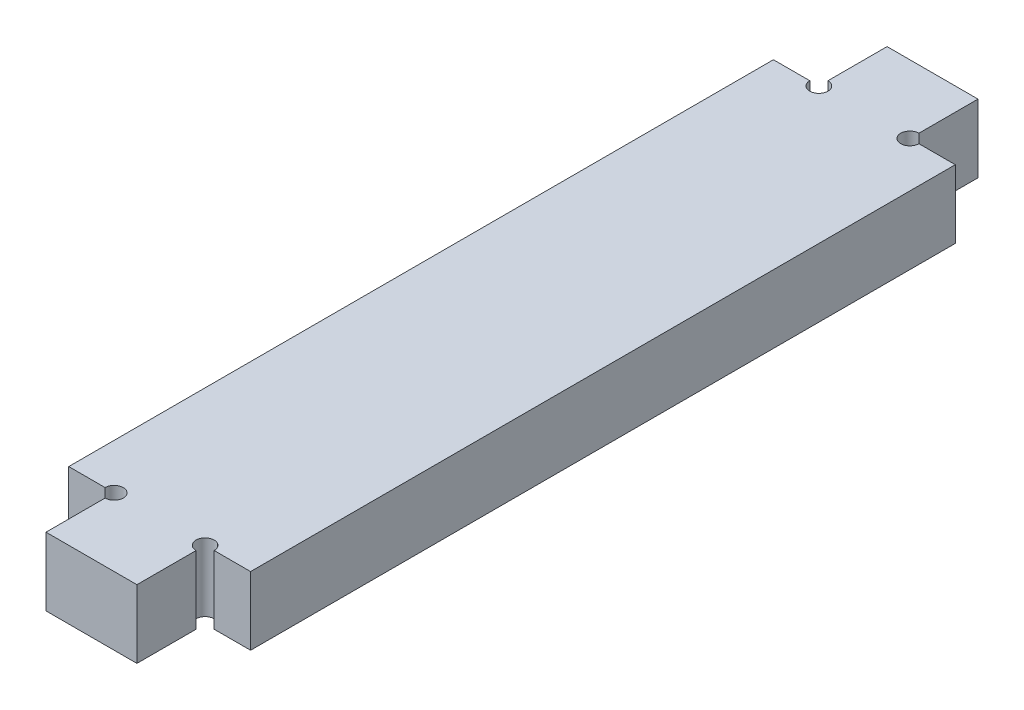
ISO-10303-21;
HEADER;
FILE_DESCRIPTION(('STEP AP214'),'2;1');
FILE_NAME('part.step','',(''),(''),'','','');
FILE_SCHEMA(('AUTOMOTIVE_DESIGN { 1 0 10303 214 1 1 1 1 }'));
ENDSEC;
DATA;
#1=APPLICATION_CONTEXT('core data for automotive mechanical design processes');
#2=APPLICATION_PROTOCOL_DEFINITION('international standard','automotive_design',2000,#1);
#3=PRODUCT_CONTEXT('',#1,'mechanical');
#4=PRODUCT('Part','Part','',(#3));
#5=PRODUCT_RELATED_PRODUCT_CATEGORY('part','',(#4));
#6=PRODUCT_DEFINITION_FORMATION('','',#4);
#7=PRODUCT_DEFINITION_CONTEXT('part definition',#1,'design');
#8=PRODUCT_DEFINITION('design','',#6,#7);
#9=PRODUCT_DEFINITION_SHAPE('','',#8);
#10=(LENGTH_UNIT() NAMED_UNIT(*) SI_UNIT(.MILLI.,.METRE.));
#11=(NAMED_UNIT(*) PLANE_ANGLE_UNIT() SI_UNIT($,.RADIAN.));
#12=(NAMED_UNIT(*) SI_UNIT($,.STERADIAN.) SOLID_ANGLE_UNIT());
#13=UNCERTAINTY_MEASURE_WITH_UNIT(LENGTH_MEASURE(1.E-05),#10,'distance_accuracy_value','');
#14=(GEOMETRIC_REPRESENTATION_CONTEXT(3) GLOBAL_UNCERTAINTY_ASSIGNED_CONTEXT((#13)) GLOBAL_UNIT_ASSIGNED_CONTEXT((#10,
#11,#12)) REPRESENTATION_CONTEXT('',''));
#15=CARTESIAN_POINT('',(0.,0.,0.));
#16=DIRECTION('',(0.,0.,1.));
#17=DIRECTION('',(1.,0.,0.));
#18=AXIS2_PLACEMENT_3D('',#15,#16,#17);
#19=CARTESIAN_POINT('',(-4.,3.,-15.5));
#20=DIRECTION('',(1.,0.,0.));
#21=DIRECTION('',(0.,0.,-1.));
#22=AXIS2_PLACEMENT_3D('',#19,#20,#21);
#23=PLANE('',#22);
#24=DIRECTION('',(0.,0.,1.));
#25=VECTOR('',#24,1.);
#26=CARTESIAN_POINT('',(-4.,0.,-15.5));
#27=LINE('',#26,#25);
#28=CARTESIAN_POINT('',(-4.,0.,-15.5));
#29=VERTEX_POINT('',#28);
#30=CARTESIAN_POINT('',(-4.,0.,15.5));
#31=VERTEX_POINT('',#30);
#32=EDGE_CURVE('E219',#29,#31,#27,.T.);
#33=ORIENTED_EDGE('',*,*,#32,.T.);
#34=DIRECTION('',(0.,-1.,0.));
#35=VECTOR('',#34,1.);
#36=CARTESIAN_POINT('',(-4.,3.,15.5));
#37=LINE('',#36,#35);
#38=CARTESIAN_POINT('',(-4.,3.,15.5));
#39=VERTEX_POINT('',#38);
#40=EDGE_CURVE('E11',#39,#31,#37,.T.);
#41=ORIENTED_EDGE('',*,*,#40,.F.);
#42=DIRECTION('',(0.,0.,1.));
#43=VECTOR('',#42,1.);
#44=CARTESIAN_POINT('',(-4.,3.,-15.5));
#45=LINE('',#44,#43);
#46=CARTESIAN_POINT('',(-4.,3.,-15.5));
#47=VERTEX_POINT('',#46);
#48=EDGE_CURVE('E184',#47,#39,#45,.T.);
#49=ORIENTED_EDGE('',*,*,#48,.F.);
#50=DIRECTION('',(0.,-1.,0.));
#51=VECTOR('',#50,1.);
#52=CARTESIAN_POINT('',(-4.,3.,-15.5));
#53=LINE('',#52,#51);
#54=EDGE_CURVE('E185',#47,#29,#53,.T.);
#55=ORIENTED_EDGE('',*,*,#54,.T.);
#56=EDGE_LOOP('',(#33,#41,#49,#55));
#57=FACE_BOUND('',#56,.T.);
#58=ADVANCED_FACE('F33',(#57),#23,.F.);
#59=CARTESIAN_POINT('',(-4.,3.,15.5));
#60=DIRECTION('',(0.,0.,-1.));
#61=DIRECTION('',(-1.,0.,0.));
#62=AXIS2_PLACEMENT_3D('',#59,#60,#61);
#63=PLANE('',#62);
#64=DIRECTION('',(1.,0.,0.));
#65=VECTOR('',#64,1.);
#66=CARTESIAN_POINT('',(-4.,0.,15.5));
#67=LINE('',#66,#65);
#68=CARTESIAN_POINT('',(-2.4,0.,15.5));
#69=VERTEX_POINT('',#68);
#70=EDGE_CURVE('E214',#31,#69,#67,.T.);
#71=ORIENTED_EDGE('',*,*,#70,.T.);
#72=DIRECTION('',(0.,1.,0.));
#73=VECTOR('',#72,1.);
#74=CARTESIAN_POINT('',(-2.4,0.,15.5));
#75=LINE('',#74,#73);
#76=CARTESIAN_POINT('',(-2.4,3.,15.5));
#77=VERTEX_POINT('',#76);
#78=EDGE_CURVE('E55',#69,#77,#75,.T.);
#79=ORIENTED_EDGE('',*,*,#78,.T.);
#80=DIRECTION('',(1.,0.,0.));
#81=VECTOR('',#80,1.);
#82=CARTESIAN_POINT('',(-4.,3.,15.5));
#83=LINE('',#82,#81);
#84=EDGE_CURVE('E243',#39,#77,#83,.T.);
#85=ORIENTED_EDGE('',*,*,#84,.F.);
#86=ORIENTED_EDGE('',*,*,#40,.T.);
#87=EDGE_LOOP('',(#71,#79,#85,#86));
#88=FACE_BOUND('',#87,.T.);
#89=ADVANCED_FACE('F286',(#88),#63,.F.);
#90=CARTESIAN_POINT('',(-2.,3.,15.5));
#91=DIRECTION('',(1.,0.,0.));
#92=DIRECTION('',(0.,0.,-1.));
#93=AXIS2_PLACEMENT_3D('',#90,#91,#92);
#94=PLANE('',#93);
#95=DIRECTION('',(0.,0.,1.));
#96=VECTOR('',#95,1.);
#97=CARTESIAN_POINT('',(-2.,3.,15.5));
#98=LINE('',#97,#96);
#99=CARTESIAN_POINT('',(-1.99999999999999,3.,15.9));
#100=VERTEX_POINT('',#99);
#101=CARTESIAN_POINT('',(-2.,3.,18.5));
#102=VERTEX_POINT('',#101);
#103=EDGE_CURVE('E241',#100,#102,#98,.T.);
#104=ORIENTED_EDGE('',*,*,#103,.F.);
#105=DIRECTION('',(0.,1.,0.));
#106=VECTOR('',#105,1.);
#107=CARTESIAN_POINT('',(-1.99999999999999,0.,15.9));
#108=LINE('',#107,#106);
#109=CARTESIAN_POINT('',(-1.99999999999999,0.,15.9));
#110=VERTEX_POINT('',#109);
#111=EDGE_CURVE('E267',#110,#100,#108,.T.);
#112=ORIENTED_EDGE('',*,*,#111,.F.);
#113=DIRECTION('',(0.,0.,1.));
#114=VECTOR('',#113,1.);
#115=CARTESIAN_POINT('',(-2.,0.,15.5));
#116=LINE('',#115,#114);
#117=CARTESIAN_POINT('',(-2.,0.,18.5));
#118=VERTEX_POINT('',#117);
#119=EDGE_CURVE('E213',#110,#118,#116,.T.);
#120=ORIENTED_EDGE('',*,*,#119,.T.);
#121=DIRECTION('',(0.,-1.,0.));
#122=VECTOR('',#121,1.);
#123=CARTESIAN_POINT('',(-2.,3.,18.5));
#124=LINE('',#123,#122);
#125=EDGE_CURVE('E40',#102,#118,#124,.T.);
#126=ORIENTED_EDGE('',*,*,#125,.F.);
#127=EDGE_LOOP('',(#104,#112,#120,#126));
#128=FACE_BOUND('',#127,.T.);
#129=ADVANCED_FACE('F282',(#128),#94,.F.);
#130=CARTESIAN_POINT('',(2.00000000000001,3.,18.5));
#131=DIRECTION('',(0.,0.,-1.));
#132=DIRECTION('',(-1.,0.,0.));
#133=AXIS2_PLACEMENT_3D('',#130,#131,#132);
#134=PLANE('',#133);
#135=DIRECTION('',(1.,0.,0.));
#136=VECTOR('',#135,1.);
#137=CARTESIAN_POINT('',(2.00000000000001,0.,18.5));
#138=LINE('',#137,#136);
#139=CARTESIAN_POINT('',(2.00000000000001,0.,18.5));
#140=VERTEX_POINT('',#139);
#141=EDGE_CURVE('E169',#118,#140,#138,.T.);
#142=ORIENTED_EDGE('',*,*,#141,.T.);
#143=DIRECTION('',(0.,-1.,0.));
#144=VECTOR('',#143,1.);
#145=CARTESIAN_POINT('',(2.00000000000001,3.,18.5));
#146=LINE('',#145,#144);
#147=CARTESIAN_POINT('',(2.00000000000001,3.,18.5));
#148=VERTEX_POINT('',#147);
#149=EDGE_CURVE('E200',#148,#140,#146,.T.);
#150=ORIENTED_EDGE('',*,*,#149,.F.);
#151=DIRECTION('',(1.,0.,0.));
#152=VECTOR('',#151,1.);
#153=CARTESIAN_POINT('',(2.00000000000001,3.,18.5));
#154=LINE('',#153,#152);
#155=EDGE_CURVE('E209',#102,#148,#154,.T.);
#156=ORIENTED_EDGE('',*,*,#155,.F.);
#157=ORIENTED_EDGE('',*,*,#125,.T.);
#158=EDGE_LOOP('',(#142,#150,#156,#157));
#159=FACE_BOUND('',#158,.T.);
#160=ADVANCED_FACE('F207',(#159),#134,.F.);
#161=CARTESIAN_POINT('',(2.00000000000001,3.,15.5));
#162=DIRECTION('',(-1.,0.,0.));
#163=DIRECTION('',(0.,0.,1.));
#164=AXIS2_PLACEMENT_3D('',#161,#162,#163);
#165=PLANE('',#164);
#166=DIRECTION('',(0.,0.,-1.));
#167=VECTOR('',#166,1.);
#168=CARTESIAN_POINT('',(2.00000000000001,0.,15.5));
#169=LINE('',#168,#167);
#170=CARTESIAN_POINT('',(2.00000000000001,0.,15.9));
#171=VERTEX_POINT('',#170);
#172=EDGE_CURVE('E165',#140,#171,#169,.T.);
#173=ORIENTED_EDGE('',*,*,#172,.T.);
#174=DIRECTION('',(0.,1.,0.));
#175=VECTOR('',#174,1.);
#176=CARTESIAN_POINT('',(2.,0.,15.9));
#177=LINE('',#176,#175);
#178=CARTESIAN_POINT('',(2.,3.,15.9));
#179=VERTEX_POINT('',#178);
#180=EDGE_CURVE('E47',#171,#179,#177,.T.);
#181=ORIENTED_EDGE('',*,*,#180,.T.);
#182=DIRECTION('',(0.,0.,-1.));
#183=VECTOR('',#182,1.);
#184=CARTESIAN_POINT('',(2.00000000000001,3.,15.5));
#185=LINE('',#184,#183);
#186=EDGE_CURVE('E237',#148,#179,#185,.T.);
#187=ORIENTED_EDGE('',*,*,#186,.F.);
#188=ORIENTED_EDGE('',*,*,#149,.T.);
#189=EDGE_LOOP('',(#173,#181,#187,#188));
#190=FACE_BOUND('',#189,.T.);
#191=ADVANCED_FACE('F278',(#190),#165,.F.);
#192=CARTESIAN_POINT('',(4.00000000000001,3.,15.5));
#193=DIRECTION('',(0.,0.,-1.));
#194=DIRECTION('',(-1.,0.,0.));
#195=AXIS2_PLACEMENT_3D('',#192,#193,#194);
#196=PLANE('',#195);
#197=DIRECTION('',(1.,0.,0.));
#198=VECTOR('',#197,1.);
#199=CARTESIAN_POINT('',(4.00000000000001,3.,15.5));
#200=LINE('',#199,#198);
#201=CARTESIAN_POINT('',(2.4,3.,15.5));
#202=VERTEX_POINT('',#201);
#203=CARTESIAN_POINT('',(4.00000000000001,3.,15.5));
#204=VERTEX_POINT('',#203);
#205=EDGE_CURVE('E159',#202,#204,#200,.T.);
#206=ORIENTED_EDGE('',*,*,#205,.F.);
#207=DIRECTION('',(0.,1.,0.));
#208=VECTOR('',#207,1.);
#209=CARTESIAN_POINT('',(2.4,0.,15.5));
#210=LINE('',#209,#208);
#211=CARTESIAN_POINT('',(2.4,0.,15.5));
#212=VERTEX_POINT('',#211);
#213=EDGE_CURVE('E145',#212,#202,#210,.T.);
#214=ORIENTED_EDGE('',*,*,#213,.F.);
#215=DIRECTION('',(1.,0.,0.));
#216=VECTOR('',#215,1.);
#217=CARTESIAN_POINT('',(4.00000000000001,0.,15.5));
#218=LINE('',#217,#216);
#219=CARTESIAN_POINT('',(4.00000000000001,0.,15.5));
#220=VERTEX_POINT('',#219);
#221=EDGE_CURVE('E157',#212,#220,#218,.T.);
#222=ORIENTED_EDGE('',*,*,#221,.T.);
#223=DIRECTION('',(0.,-1.,0.));
#224=VECTOR('',#223,1.);
#225=CARTESIAN_POINT('',(4.00000000000001,3.,15.5));
#226=LINE('',#225,#224);
#227=EDGE_CURVE('E198',#204,#220,#226,.T.);
#228=ORIENTED_EDGE('',*,*,#227,.F.);
#229=EDGE_LOOP('',(#206,#214,#222,#228));
#230=FACE_BOUND('',#229,.T.);
#231=ADVANCED_FACE('F155',(#230),#196,.F.);
#232=CARTESIAN_POINT('',(4.,3.,-15.5));
#233=DIRECTION('',(-1.,0.,0.));
#234=DIRECTION('',(0.,0.,1.));
#235=AXIS2_PLACEMENT_3D('',#232,#233,#234);
#236=PLANE('',#235);
#237=DIRECTION('',(0.,0.,-1.));
#238=VECTOR('',#237,1.);
#239=CARTESIAN_POINT('',(4.,0.,-15.5));
#240=LINE('',#239,#238);
#241=CARTESIAN_POINT('',(4.,0.,-15.5));
#242=VERTEX_POINT('',#241);
#243=EDGE_CURVE('E164',#220,#242,#240,.T.);
#244=ORIENTED_EDGE('',*,*,#243,.T.);
#245=DIRECTION('',(0.,-1.,0.));
#246=VECTOR('',#245,1.);
#247=CARTESIAN_POINT('',(4.,3.,-15.5));
#248=LINE('',#247,#246);
#249=CARTESIAN_POINT('',(4.,3.,-15.5));
#250=VERTEX_POINT('',#249);
#251=EDGE_CURVE('E195',#250,#242,#248,.T.);
#252=ORIENTED_EDGE('',*,*,#251,.F.);
#253=DIRECTION('',(0.,0.,-1.));
#254=VECTOR('',#253,1.);
#255=CARTESIAN_POINT('',(4.,3.,-15.5));
#256=LINE('',#255,#254);
#257=EDGE_CURVE('E234',#204,#250,#256,.T.);
#258=ORIENTED_EDGE('',*,*,#257,.F.);
#259=ORIENTED_EDGE('',*,*,#227,.T.);
#260=EDGE_LOOP('',(#244,#252,#258,#259));
#261=FACE_BOUND('',#260,.T.);
#262=ADVANCED_FACE('F323',(#261),#236,.F.);
#263=CARTESIAN_POINT('',(4.,3.,-15.5));
#264=DIRECTION('',(0.,0.,1.));
#265=DIRECTION('',(1.,0.,0.));
#266=AXIS2_PLACEMENT_3D('',#263,#264,#265);
#267=PLANE('',#266);
#268=DIRECTION('',(-1.,0.,0.));
#269=VECTOR('',#268,1.);
#270=CARTESIAN_POINT('',(4.,0.,-15.5));
#271=LINE('',#270,#269);
#272=CARTESIAN_POINT('',(2.4,0.,-15.5));
#273=VERTEX_POINT('',#272);
#274=EDGE_CURVE('E167',#242,#273,#271,.T.);
#275=ORIENTED_EDGE('',*,*,#274,.T.);
#276=DIRECTION('',(0.,1.,0.));
#277=VECTOR('',#276,1.);
#278=CARTESIAN_POINT('',(2.4,0.,-15.5));
#279=LINE('',#278,#277);
#280=CARTESIAN_POINT('',(2.4,3.,-15.5));
#281=VERTEX_POINT('',#280);
#282=EDGE_CURVE('E222',#273,#281,#279,.T.);
#283=ORIENTED_EDGE('',*,*,#282,.T.);
#284=DIRECTION('',(-1.,0.,0.));
#285=VECTOR('',#284,1.);
#286=CARTESIAN_POINT('',(4.,3.,-15.5));
#287=LINE('',#286,#285);
#288=EDGE_CURVE('E231',#250,#281,#287,.T.);
#289=ORIENTED_EDGE('',*,*,#288,.F.);
#290=ORIENTED_EDGE('',*,*,#251,.T.);
#291=EDGE_LOOP('',(#275,#283,#289,#290));
#292=FACE_BOUND('',#291,.T.);
#293=ADVANCED_FACE('F321',(#292),#267,.F.);
#294=CARTESIAN_POINT('',(2.,3.,-15.5));
#295=DIRECTION('',(-1.,0.,0.));
#296=DIRECTION('',(0.,0.,1.));
#297=AXIS2_PLACEMENT_3D('',#294,#295,#296);
#298=PLANE('',#297);
#299=DIRECTION('',(0.,0.,-1.));
#300=VECTOR('',#299,1.);
#301=CARTESIAN_POINT('',(2.,3.,-15.5));
#302=LINE('',#301,#300);
#303=CARTESIAN_POINT('',(2.,3.,-15.9));
#304=VERTEX_POINT('',#303);
#305=CARTESIAN_POINT('',(2.,3.,-18.5));
#306=VERTEX_POINT('',#305);
#307=EDGE_CURVE('E229',#304,#306,#302,.T.);
#308=ORIENTED_EDGE('',*,*,#307,.F.);
#309=DIRECTION('',(0.,1.,0.));
#310=VECTOR('',#309,1.);
#311=CARTESIAN_POINT('',(2.,0.,-15.9));
#312=LINE('',#311,#310);
#313=CARTESIAN_POINT('',(2.,0.,-15.9));
#314=VERTEX_POINT('',#313);
#315=EDGE_CURVE('E248',#314,#304,#312,.T.);
#316=ORIENTED_EDGE('',*,*,#315,.F.);
#317=DIRECTION('',(0.,0.,-1.));
#318=VECTOR('',#317,1.);
#319=CARTESIAN_POINT('',(2.,0.,-15.5));
#320=LINE('',#319,#318);
#321=CARTESIAN_POINT('',(2.,0.,-18.5));
#322=VERTEX_POINT('',#321);
#323=EDGE_CURVE('E175',#314,#322,#320,.T.);
#324=ORIENTED_EDGE('',*,*,#323,.T.);
#325=DIRECTION('',(0.,-1.,0.));
#326=VECTOR('',#325,1.);
#327=CARTESIAN_POINT('',(2.,3.,-18.5));
#328=LINE('',#327,#326);
#329=EDGE_CURVE('E192',#306,#322,#328,.T.);
#330=ORIENTED_EDGE('',*,*,#329,.F.);
#331=EDGE_LOOP('',(#308,#316,#324,#330));
#332=FACE_BOUND('',#331,.T.);
#333=ADVANCED_FACE('F312',(#332),#298,.F.);
#334=CARTESIAN_POINT('',(2.,3.,-18.5));
#335=DIRECTION('',(0.,0.,1.));
#336=DIRECTION('',(1.,0.,0.));
#337=AXIS2_PLACEMENT_3D('',#334,#335,#336);
#338=PLANE('',#337);
#339=DIRECTION('',(-1.,0.,0.));
#340=VECTOR('',#339,1.);
#341=CARTESIAN_POINT('',(2.,0.,-18.5));
#342=LINE('',#341,#340);
#343=CARTESIAN_POINT('',(-2.,0.,-18.5));
#344=VERTEX_POINT('',#343);
#345=EDGE_CURVE('E177',#322,#344,#342,.T.);
#346=ORIENTED_EDGE('',*,*,#345,.T.);
#347=DIRECTION('',(0.,-1.,0.));
#348=VECTOR('',#347,1.);
#349=CARTESIAN_POINT('',(-2.,3.,-18.5));
#350=LINE('',#349,#348);
#351=CARTESIAN_POINT('',(-2.,3.,-18.5));
#352=VERTEX_POINT('',#351);
#353=EDGE_CURVE('E188',#352,#344,#350,.T.);
#354=ORIENTED_EDGE('',*,*,#353,.F.);
#355=DIRECTION('',(-1.,0.,0.));
#356=VECTOR('',#355,1.);
#357=CARTESIAN_POINT('',(2.,3.,-18.5));
#358=LINE('',#357,#356);
#359=EDGE_CURVE('E227',#306,#352,#358,.T.);
#360=ORIENTED_EDGE('',*,*,#359,.F.);
#361=ORIENTED_EDGE('',*,*,#329,.T.);
#362=EDGE_LOOP('',(#346,#354,#360,#361));
#363=FACE_BOUND('',#362,.T.);
#364=ADVANCED_FACE('F308',(#363),#338,.F.);
#365=CARTESIAN_POINT('',(-2.,3.,-15.5));
#366=DIRECTION('',(1.,0.,0.));
#367=DIRECTION('',(0.,0.,-1.));
#368=AXIS2_PLACEMENT_3D('',#365,#366,#367);
#369=PLANE('',#368);
#370=DIRECTION('',(0.,0.,1.));
#371=VECTOR('',#370,1.);
#372=CARTESIAN_POINT('',(-2.,0.,-15.5));
#373=LINE('',#372,#371);
#374=CARTESIAN_POINT('',(-2.,0.,-15.9));
#375=VERTEX_POINT('',#374);
#376=EDGE_CURVE('E179',#344,#375,#373,.T.);
#377=ORIENTED_EDGE('',*,*,#376,.T.);
#378=DIRECTION('',(0.,1.,0.));
#379=VECTOR('',#378,1.);
#380=CARTESIAN_POINT('',(-2.,0.,-15.9));
#381=LINE('',#380,#379);
#382=CARTESIAN_POINT('',(-2.,3.,-15.9));
#383=VERTEX_POINT('',#382);
#384=EDGE_CURVE('E255',#375,#383,#381,.T.);
#385=ORIENTED_EDGE('',*,*,#384,.T.);
#386=DIRECTION('',(0.,0.,1.));
#387=VECTOR('',#386,1.);
#388=CARTESIAN_POINT('',(-2.,3.,-15.5));
#389=LINE('',#388,#387);
#390=EDGE_CURVE('E224',#352,#383,#389,.T.);
#391=ORIENTED_EDGE('',*,*,#390,.F.);
#392=ORIENTED_EDGE('',*,*,#353,.T.);
#393=EDGE_LOOP('',(#377,#385,#391,#392));
#394=FACE_BOUND('',#393,.T.);
#395=ADVANCED_FACE('F304',(#394),#369,.F.);
#396=CARTESIAN_POINT('',(-4.,3.,-15.5));
#397=DIRECTION('',(0.,0.,1.));
#398=DIRECTION('',(1.,0.,0.));
#399=AXIS2_PLACEMENT_3D('',#396,#397,#398);
#400=PLANE('',#399);
#401=DIRECTION('',(-1.,0.,0.));
#402=VECTOR('',#401,1.);
#403=CARTESIAN_POINT('',(-4.,3.,-15.5));
#404=LINE('',#403,#402);
#405=CARTESIAN_POINT('',(-2.4,3.,-15.5));
#406=VERTEX_POINT('',#405);
#407=EDGE_CURVE('E189',#406,#47,#404,.T.);
#408=ORIENTED_EDGE('',*,*,#407,.F.);
#409=DIRECTION('',(0.,1.,0.));
#410=VECTOR('',#409,1.);
#411=CARTESIAN_POINT('',(-2.4,0.,-15.5));
#412=LINE('',#411,#410);
#413=CARTESIAN_POINT('',(-2.4,0.,-15.5));
#414=VERTEX_POINT('',#413);
#415=EDGE_CURVE('E258',#414,#406,#412,.T.);
#416=ORIENTED_EDGE('',*,*,#415,.F.);
#417=DIRECTION('',(-1.,0.,0.));
#418=VECTOR('',#417,1.);
#419=CARTESIAN_POINT('',(-4.,0.,-15.5));
#420=LINE('',#419,#418);
#421=EDGE_CURVE('E182',#414,#29,#420,.T.);
#422=ORIENTED_EDGE('',*,*,#421,.T.);
#423=ORIENTED_EDGE('',*,*,#54,.F.);
#424=EDGE_LOOP('',(#408,#416,#422,#423));
#425=FACE_BOUND('',#424,.T.);
#426=ADVANCED_FACE('F296',(#425),#400,.F.);
#427=CARTESIAN_POINT('',(0.,3.,0.));
#428=DIRECTION('',(0.,1.,0.));
#429=DIRECTION('',(0.,0.,1.));
#430=AXIS2_PLACEMENT_3D('',#427,#428,#429);
#431=PLANE('',#430);
#432=CARTESIAN_POINT('',(2.,3.,15.5));
#433=DIRECTION('',(0.,1.,0.));
#434=DIRECTION('',(0.,0.,-1.));
#435=AXIS2_PLACEMENT_3D('',#432,#433,#434);
#436=CIRCLE('',#435,0.400000000000002);
#437=EDGE_CURVE('E151',#202,#179,#436,.T.);
#438=ORIENTED_EDGE('',*,*,#437,.F.);
#439=ORIENTED_EDGE('',*,*,#205,.T.);
#440=ORIENTED_EDGE('',*,*,#257,.T.);
#441=ORIENTED_EDGE('',*,*,#288,.T.);
#442=CARTESIAN_POINT('',(2.,3.,-15.5));
#443=DIRECTION('',(0.,1.,0.));
#444=DIRECTION('',(0.,0.,1.));
#445=AXIS2_PLACEMENT_3D('',#442,#443,#444);
#446=CIRCLE('',#445,0.400000000000002);
#447=EDGE_CURVE('E253',#304,#281,#446,.T.);
#448=ORIENTED_EDGE('',*,*,#447,.F.);
#449=ORIENTED_EDGE('',*,*,#307,.T.);
#450=ORIENTED_EDGE('',*,*,#359,.T.);
#451=ORIENTED_EDGE('',*,*,#390,.T.);
#452=CARTESIAN_POINT('',(-2.,3.,-15.5));
#453=DIRECTION('',(0.,1.,0.));
#454=DIRECTION('',(0.,0.,-1.));
#455=AXIS2_PLACEMENT_3D('',#452,#453,#454);
#456=CIRCLE('',#455,0.400000000000002);
#457=EDGE_CURVE('E263',#406,#383,#456,.T.);
#458=ORIENTED_EDGE('',*,*,#457,.F.);
#459=ORIENTED_EDGE('',*,*,#407,.T.);
#460=ORIENTED_EDGE('',*,*,#48,.T.);
#461=ORIENTED_EDGE('',*,*,#84,.T.);
#462=CARTESIAN_POINT('',(-1.99999999999999,3.,15.5));
#463=DIRECTION('',(0.,1.,0.));
#464=DIRECTION('',(0.,0.,1.));
#465=AXIS2_PLACEMENT_3D('',#462,#463,#464);
#466=CIRCLE('',#465,0.400000000000002);
#467=EDGE_CURVE('E271',#100,#77,#466,.T.);
#468=ORIENTED_EDGE('',*,*,#467,.F.);
#469=ORIENTED_EDGE('',*,*,#103,.T.);
#470=ORIENTED_EDGE('',*,*,#155,.T.);
#471=ORIENTED_EDGE('',*,*,#186,.T.);
#472=EDGE_LOOP('',(#438,#439,#440,#441,#448,#449,#450,#451,#458,#459,#460,#461,#468,#469,#470,#471));
#473=FACE_BOUND('',#472,.T.);
#474=ADVANCED_FACE('F279',(#473),#431,.T.);
#475=CARTESIAN_POINT('',(0.,0.,0.));
#476=DIRECTION('',(0.,1.,0.));
#477=DIRECTION('',(0.,0.,1.));
#478=AXIS2_PLACEMENT_3D('',#475,#476,#477);
#479=PLANE('',#478);
#480=ORIENTED_EDGE('',*,*,#221,.F.);
#481=CARTESIAN_POINT('',(2.,0.,15.5));
#482=DIRECTION('',(0.,1.,0.));
#483=DIRECTION('',(0.,0.,-1.));
#484=AXIS2_PLACEMENT_3D('',#481,#482,#483);
#485=CIRCLE('',#484,0.400000000000002);
#486=EDGE_CURVE('E142',#212,#171,#485,.T.);
#487=ORIENTED_EDGE('',*,*,#486,.T.);
#488=ORIENTED_EDGE('',*,*,#172,.F.);
#489=ORIENTED_EDGE('',*,*,#141,.F.);
#490=ORIENTED_EDGE('',*,*,#119,.F.);
#491=CARTESIAN_POINT('',(-1.99999999999999,0.,15.5));
#492=DIRECTION('',(0.,1.,0.));
#493=DIRECTION('',(0.,0.,1.));
#494=AXIS2_PLACEMENT_3D('',#491,#492,#493);
#495=CIRCLE('',#494,0.400000000000002);
#496=EDGE_CURVE('E269',#110,#69,#495,.T.);
#497=ORIENTED_EDGE('',*,*,#496,.T.);
#498=ORIENTED_EDGE('',*,*,#70,.F.);
#499=ORIENTED_EDGE('',*,*,#32,.F.);
#500=ORIENTED_EDGE('',*,*,#421,.F.);
#501=CARTESIAN_POINT('',(-2.,0.,-15.5));
#502=DIRECTION('',(0.,1.,0.));
#503=DIRECTION('',(0.,0.,-1.));
#504=AXIS2_PLACEMENT_3D('',#501,#502,#503);
#505=CIRCLE('',#504,0.400000000000002);
#506=EDGE_CURVE('E260',#414,#375,#505,.T.);
#507=ORIENTED_EDGE('',*,*,#506,.T.);
#508=ORIENTED_EDGE('',*,*,#376,.F.);
#509=ORIENTED_EDGE('',*,*,#345,.F.);
#510=ORIENTED_EDGE('',*,*,#323,.F.);
#511=CARTESIAN_POINT('',(2.,0.,-15.5));
#512=DIRECTION('',(0.,1.,0.));
#513=DIRECTION('',(0.,0.,1.));
#514=AXIS2_PLACEMENT_3D('',#511,#512,#513);
#515=CIRCLE('',#514,0.400000000000002);
#516=EDGE_CURVE('E250',#314,#273,#515,.T.);
#517=ORIENTED_EDGE('',*,*,#516,.T.);
#518=ORIENTED_EDGE('',*,*,#274,.F.);
#519=ORIENTED_EDGE('',*,*,#243,.F.);
#520=EDGE_LOOP('',(#480,#487,#488,#489,#490,#497,#498,#499,#500,#507,#508,#509,#510,#517,#518,#519));
#521=FACE_BOUND('',#520,.T.);
#522=ADVANCED_FACE('F162',(#521),#479,.F.);
#523=CARTESIAN_POINT('',(2.,0.,-15.5));
#524=DIRECTION('',(0.,1.,0.));
#525=DIRECTION('',(0.,0.,1.));
#526=AXIS2_PLACEMENT_3D('',#523,#524,#525);
#527=CYLINDRICAL_SURFACE('',#526,0.400000000000002);
#528=ORIENTED_EDGE('',*,*,#447,.T.);
#529=ORIENTED_EDGE('',*,*,#282,.F.);
#530=ORIENTED_EDGE('',*,*,#516,.F.);
#531=ORIENTED_EDGE('',*,*,#315,.T.);
#532=EDGE_LOOP('',(#528,#529,#530,#531));
#533=FACE_BOUND('',#532,.T.);
#534=ADVANCED_FACE('F316',(#533),#527,.F.);
#535=CARTESIAN_POINT('',(-2.,0.,-15.5));
#536=DIRECTION('',(0.,1.,0.));
#537=DIRECTION('',(0.,0.,1.));
#538=AXIS2_PLACEMENT_3D('',#535,#536,#537);
#539=CYLINDRICAL_SURFACE('',#538,0.400000000000002);
#540=ORIENTED_EDGE('',*,*,#457,.T.);
#541=ORIENTED_EDGE('',*,*,#384,.F.);
#542=ORIENTED_EDGE('',*,*,#506,.F.);
#543=ORIENTED_EDGE('',*,*,#415,.T.);
#544=EDGE_LOOP('',(#540,#541,#542,#543));
#545=FACE_BOUND('',#544,.T.);
#546=ADVANCED_FACE('F299',(#545),#539,.F.);
#547=CARTESIAN_POINT('',(-1.99999999999999,0.,15.5));
#548=DIRECTION('',(0.,1.,0.));
#549=DIRECTION('',(0.,0.,1.));
#550=AXIS2_PLACEMENT_3D('',#547,#548,#549);
#551=CYLINDRICAL_SURFACE('',#550,0.400000000000002);
#552=ORIENTED_EDGE('',*,*,#467,.T.);
#553=ORIENTED_EDGE('',*,*,#78,.F.);
#554=ORIENTED_EDGE('',*,*,#496,.F.);
#555=ORIENTED_EDGE('',*,*,#111,.T.);
#556=EDGE_LOOP('',(#552,#553,#554,#555));
#557=FACE_BOUND('',#556,.T.);
#558=ADVANCED_FACE('F283',(#557),#551,.F.);
#559=CARTESIAN_POINT('',(2.,0.,15.5));
#560=DIRECTION('',(0.,1.,0.));
#561=DIRECTION('',(0.,0.,1.));
#562=AXIS2_PLACEMENT_3D('',#559,#560,#561);
#563=CYLINDRICAL_SURFACE('',#562,0.400000000000002);
#564=ORIENTED_EDGE('',*,*,#437,.T.);
#565=ORIENTED_EDGE('',*,*,#180,.F.);
#566=ORIENTED_EDGE('',*,*,#486,.F.);
#567=ORIENTED_EDGE('',*,*,#213,.T.);
#568=EDGE_LOOP('',(#564,#565,#566,#567));
#569=FACE_BOUND('',#568,.T.);
#570=ADVANCED_FACE('F144',(#569),#563,.F.);
#571=CLOSED_SHELL('',(#58,#89,#129,#160,#191,#231,#262,#293,#333,#364,#395,#426,#474,#522,#534,
#546,#558,#570));
#572=MANIFOLD_SOLID_BREP('B2',#571);
#573=ADVANCED_BREP_SHAPE_REPRESENTATION('',(#18,#572),#14);
#574=SHAPE_DEFINITION_REPRESENTATION(#9,#573);
ENDSEC;
END-ISO-10303-21;
